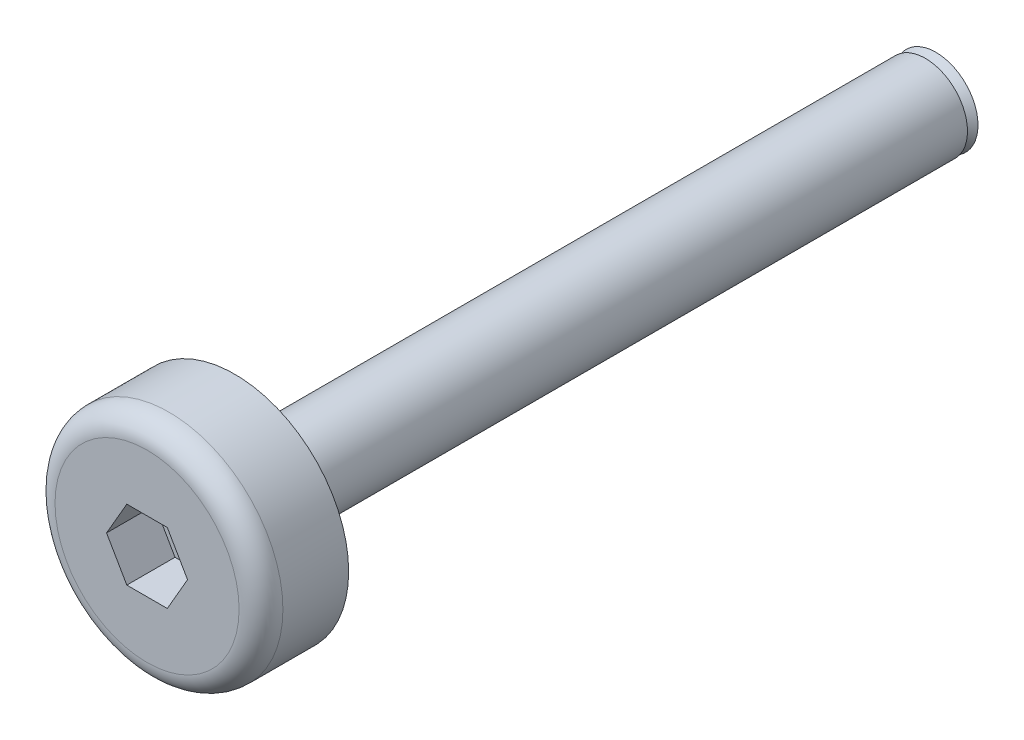
ISO-10303-21;
HEADER;
FILE_DESCRIPTION(('STEP AP214'),'2;1');
FILE_NAME('part.step','',(''),(''),'','','');
FILE_SCHEMA(('AUTOMOTIVE_DESIGN { 1 0 10303 214 1 1 1 1 }'));
ENDSEC;
DATA;
#1=APPLICATION_CONTEXT('core data for automotive mechanical design processes');
#2=APPLICATION_PROTOCOL_DEFINITION('international standard','automotive_design',2000,#1);
#3=PRODUCT_CONTEXT('',#1,'mechanical');
#4=PRODUCT('Part','Part','',(#3));
#5=PRODUCT_RELATED_PRODUCT_CATEGORY('part','',(#4));
#6=PRODUCT_DEFINITION_FORMATION('','',#4);
#7=PRODUCT_DEFINITION_CONTEXT('part definition',#1,'design');
#8=PRODUCT_DEFINITION('design','',#6,#7);
#9=PRODUCT_DEFINITION_SHAPE('','',#8);
#10=(LENGTH_UNIT() NAMED_UNIT(*) SI_UNIT(.MILLI.,.METRE.));
#11=(NAMED_UNIT(*) PLANE_ANGLE_UNIT() SI_UNIT($,.RADIAN.));
#12=(NAMED_UNIT(*) SI_UNIT($,.STERADIAN.) SOLID_ANGLE_UNIT());
#13=UNCERTAINTY_MEASURE_WITH_UNIT(LENGTH_MEASURE(1.E-05),#10,'distance_accuracy_value','');
#14=(GEOMETRIC_REPRESENTATION_CONTEXT(3) GLOBAL_UNCERTAINTY_ASSIGNED_CONTEXT((#13)) GLOBAL_UNIT_ASSIGNED_CONTEXT((#10,
#11,#12)) REPRESENTATION_CONTEXT('',''));
#15=CARTESIAN_POINT('',(0.,0.,0.));
#16=DIRECTION('',(0.,0.,1.));
#17=DIRECTION('',(1.,0.,0.));
#18=AXIS2_PLACEMENT_3D('',#15,#16,#17);
#19=CARTESIAN_POINT('',(0.,0.,-20.));
#20=DIRECTION('',(0.,0.,1.));
#21=DIRECTION('',(1.,0.,0.));
#22=AXIS2_PLACEMENT_3D('',#19,#20,#21);
#23=PLANE('',#22);
#24=CARTESIAN_POINT('',(0.,0.,-20.));
#25=DIRECTION('',(0.,0.,1.));
#26=DIRECTION('',(1.,0.,0.));
#27=AXIS2_PLACEMENT_3D('',#24,#25,#26);
#28=CIRCLE('',#27,1.2);
#29=CARTESIAN_POINT('',(1.2,0.,-20.));
#30=VERTEX_POINT('',#29);
#31=EDGE_CURVE('E9',#30,#30,#28,.T.);
#32=ORIENTED_EDGE('',*,*,#31,.F.);
#33=EDGE_LOOP('',(#32));
#34=FACE_BOUND('',#33,.T.);
#35=ADVANCED_FACE('F14',(#34),#23,.F.);
#36=CARTESIAN_POINT('',(0.,0.,-20.));
#37=DIRECTION('',(0.,0.,-1.));
#38=DIRECTION('',(1.,0.,0.));
#39=AXIS2_PLACEMENT_3D('',#36,#37,#38);
#40=CONICAL_SURFACE('',#39,1.2,0.785398163397);
#41=CARTESIAN_POINT('',(0.,0.,-19.7));
#42=DIRECTION('',(0.,0.,1.));
#43=DIRECTION('',(1.,0.,0.));
#44=AXIS2_PLACEMENT_3D('',#41,#42,#43);
#45=CIRCLE('',#44,0.9);
#46=CARTESIAN_POINT('',(0.9,0.,-19.7));
#47=VERTEX_POINT('',#46);
#48=EDGE_CURVE('E166',#47,#47,#45,.T.);
#49=ORIENTED_EDGE('',*,*,#48,.F.);
#50=DIRECTION('',(-0.707106781186548,0.,0.707106781186548));
#51=VECTOR('',#50,1.);
#52=CARTESIAN_POINT('',(1.2,0.,-20.));
#53=LINE('',#52,#51);
#54=EDGE_CURVE('E25',#30,#47,#53,.T.);
#55=ORIENTED_EDGE('',*,*,#54,.F.);
#56=ORIENTED_EDGE('',*,*,#31,.T.);
#57=ORIENTED_EDGE('',*,*,#54,.T.);
#58=EDGE_LOOP('',(#49,#55,#56,#57));
#59=FACE_BOUND('',#58,.T.);
#60=ADVANCED_FACE('F325',(#59),#40,.T.);
#61=CARTESIAN_POINT('',(0.,0.,1.125));
#62=DIRECTION('',(0.,0.,1.));
#63=DIRECTION('',(1.,0.,0.));
#64=AXIS2_PLACEMENT_3D('',#61,#62,#63);
#65=PLANE('',#64);
#66=DIRECTION('',(-0.50000000000019,0.866025403784329,0.));
#67=VECTOR('',#66,1.);
#68=CARTESIAN_POINT('',(1.154700538379,0.,1.125));
#69=LINE('',#68,#67);
#70=CARTESIAN_POINT('',(1.154700538379,0.,1.125));
#71=VERTEX_POINT('',#70);
#72=CARTESIAN_POINT('',(0.57735026919,1.,1.125));
#73=VERTEX_POINT('',#72);
#74=EDGE_CURVE('E197',#71,#73,#69,.T.);
#75=ORIENTED_EDGE('',*,*,#74,.T.);
#76=DIRECTION('',(-1.,0.,0.));
#77=VECTOR('',#76,1.);
#78=CARTESIAN_POINT('',(0.57735026919,1.,1.125));
#79=LINE('',#78,#77);
#80=CARTESIAN_POINT('',(-0.57735026919,1.,1.125));
#81=VERTEX_POINT('',#80);
#82=EDGE_CURVE('E136',#73,#81,#79,.T.);
#83=ORIENTED_EDGE('',*,*,#82,.T.);
#84=DIRECTION('',(-0.50000000000019,-0.866025403784329,0.));
#85=VECTOR('',#84,1.);
#86=CARTESIAN_POINT('',(-0.57735026919,1.,1.125));
#87=LINE('',#86,#85);
#88=CARTESIAN_POINT('',(-1.154700538379,0.,1.125));
#89=VERTEX_POINT('',#88);
#90=EDGE_CURVE('E141',#81,#89,#87,.T.);
#91=ORIENTED_EDGE('',*,*,#90,.T.);
#92=DIRECTION('',(0.50000000000019,-0.866025403784329,0.));
#93=VECTOR('',#92,1.);
#94=CARTESIAN_POINT('',(-1.154700538379,0.,1.125));
#95=LINE('',#94,#93);
#96=CARTESIAN_POINT('',(-0.57735026919,-1.,1.125));
#97=VERTEX_POINT('',#96);
#98=EDGE_CURVE('E131',#89,#97,#95,.T.);
#99=ORIENTED_EDGE('',*,*,#98,.T.);
#100=DIRECTION('',(1.,0.,0.));
#101=VECTOR('',#100,1.);
#102=CARTESIAN_POINT('',(-0.57735026919,-1.,1.125));
#103=LINE('',#102,#101);
#104=CARTESIAN_POINT('',(0.57735026919,-1.,1.125));
#105=VERTEX_POINT('',#104);
#106=EDGE_CURVE('E130',#97,#105,#103,.T.);
#107=ORIENTED_EDGE('',*,*,#106,.T.);
#108=DIRECTION('',(0.50000000000019,0.866025403784329,0.));
#109=VECTOR('',#108,1.);
#110=CARTESIAN_POINT('',(0.57735026919,-1.,1.125));
#111=LINE('',#110,#109);
#112=EDGE_CURVE('E18',#105,#71,#111,.T.);
#113=ORIENTED_EDGE('',*,*,#112,.T.);
#114=EDGE_LOOP('',(#75,#83,#91,#99,#107,#113));
#115=FACE_BOUND('',#114,.T.);
#116=ADVANCED_FACE('F213',(#115),#65,.T.);
#117=CARTESIAN_POINT('',(0.,0.,-19.7));
#118=DIRECTION('',(0.,0.,1.));
#119=DIRECTION('',(1.,0.,0.));
#120=AXIS2_PLACEMENT_3D('',#117,#118,#119);
#121=PLANE('',#120);
#122=ORIENTED_EDGE('',*,*,#48,.T.);
#123=EDGE_LOOP('',(#122));
#124=FACE_BOUND('',#123,.T.);
#125=CARTESIAN_POINT('',(0.,0.,-19.7));
#126=DIRECTION('',(0.,0.,1.));
#127=DIRECTION('',(1.,0.,0.));
#128=AXIS2_PLACEMENT_3D('',#125,#126,#127);
#129=CIRCLE('',#128,1.2);
#130=CARTESIAN_POINT('',(1.2,0.,-19.7));
#131=VERTEX_POINT('',#130);
#132=EDGE_CURVE('E149',#131,#131,#129,.T.);
#133=ORIENTED_EDGE('',*,*,#132,.F.);
#134=EDGE_LOOP('',(#133));
#135=FACE_BOUND('',#134,.T.);
#136=ADVANCED_FACE('F324',(#124,#135),#121,.F.);
#137=CARTESIAN_POINT('',(1.154700538379,0.,1.125));
#138=DIRECTION('',(-0.866025403784329,-0.50000000000019,0.));
#139=DIRECTION('',(-0.50000000000019,0.866025403784329,0.));
#140=AXIS2_PLACEMENT_3D('',#137,#138,#139);
#141=PLANE('',#140);
#142=ORIENTED_EDGE('',*,*,#74,.F.);
#143=DIRECTION('',(0.,0.,1.));
#144=VECTOR('',#143,1.);
#145=CARTESIAN_POINT('',(1.154700538379,0.,1.125));
#146=LINE('',#145,#144);
#147=CARTESIAN_POINT('',(1.154700538379,0.,2.5));
#148=VERTEX_POINT('',#147);
#149=EDGE_CURVE('E202',#71,#148,#146,.T.);
#150=ORIENTED_EDGE('',*,*,#149,.T.);
#151=DIRECTION('',(0.50000000000019,-0.866025403784329,0.));
#152=VECTOR('',#151,1.);
#153=CARTESIAN_POINT('',(1.010362971082,0.25,2.5));
#154=LINE('',#153,#152);
#155=CARTESIAN_POINT('',(0.57735026919,1.,2.5));
#156=VERTEX_POINT('',#155);
#157=EDGE_CURVE('E184',#156,#148,#154,.T.);
#158=ORIENTED_EDGE('',*,*,#157,.F.);
#159=DIRECTION('',(0.,0.,1.));
#160=VECTOR('',#159,1.);
#161=CARTESIAN_POINT('',(0.57735026919,1.,1.125));
#162=LINE('',#161,#160);
#163=EDGE_CURVE('E132',#73,#156,#162,.T.);
#164=ORIENTED_EDGE('',*,*,#163,.F.);
#165=EDGE_LOOP('',(#142,#150,#158,#164));
#166=FACE_BOUND('',#165,.T.);
#167=ADVANCED_FACE('F387',(#166),#141,.T.);
#168=CARTESIAN_POINT('',(0.57735026919,-1.,1.125));
#169=DIRECTION('',(-0.866025403784329,0.50000000000019,0.));
#170=DIRECTION('',(0.,0.,1.));
#171=AXIS2_PLACEMENT_3D('',#168,#169,#170);
#172=PLANE('',#171);
#173=ORIENTED_EDGE('',*,*,#112,.F.);
#174=DIRECTION('',(0.,0.,1.));
#175=VECTOR('',#174,1.);
#176=CARTESIAN_POINT('',(0.57735026919,-1.,1.125));
#177=LINE('',#176,#175);
#178=CARTESIAN_POINT('',(0.57735026919,-1.,2.5));
#179=VERTEX_POINT('',#178);
#180=EDGE_CURVE('E126',#105,#179,#177,.T.);
#181=ORIENTED_EDGE('',*,*,#180,.T.);
#182=DIRECTION('',(-0.50000000000019,-0.866025403784329,0.));
#183=VECTOR('',#182,1.);
#184=CARTESIAN_POINT('',(0.721687836487,-0.75,2.5));
#185=LINE('',#184,#183);
#186=EDGE_CURVE('E160',#148,#179,#185,.T.);
#187=ORIENTED_EDGE('',*,*,#186,.F.);
#188=ORIENTED_EDGE('',*,*,#149,.F.);
#189=EDGE_LOOP('',(#173,#181,#187,#188));
#190=FACE_BOUND('',#189,.T.);
#191=ADVANCED_FACE('F240',(#190),#172,.T.);
#192=CARTESIAN_POINT('',(-0.57735026919,-1.,1.125));
#193=DIRECTION('',(0.,1.,0.));
#194=DIRECTION('',(1.,0.,0.));
#195=AXIS2_PLACEMENT_3D('',#192,#193,#194);
#196=PLANE('',#195);
#197=ORIENTED_EDGE('',*,*,#106,.F.);
#198=DIRECTION('',(0.,0.,1.));
#199=VECTOR('',#198,1.);
#200=CARTESIAN_POINT('',(-0.57735026919,-1.,1.125));
#201=LINE('',#200,#199);
#202=CARTESIAN_POINT('',(-0.57735026919,-1.,2.5));
#203=VERTEX_POINT('',#202);
#204=EDGE_CURVE('E127',#97,#203,#201,.T.);
#205=ORIENTED_EDGE('',*,*,#204,.T.);
#206=DIRECTION('',(-1.,0.,0.));
#207=VECTOR('',#206,1.);
#208=CARTESIAN_POINT('',(-0.288675134595,-1.,2.5));
#209=LINE('',#208,#207);
#210=EDGE_CURVE('E155',#179,#203,#209,.T.);
#211=ORIENTED_EDGE('',*,*,#210,.F.);
#212=ORIENTED_EDGE('',*,*,#180,.F.);
#213=EDGE_LOOP('',(#197,#205,#211,#212));
#214=FACE_BOUND('',#213,.T.);
#215=ADVANCED_FACE('F229',(#214),#196,.T.);
#216=CARTESIAN_POINT('',(-1.154700538379,0.,1.125));
#217=DIRECTION('',(0.866025403784329,0.50000000000019,0.));
#218=DIRECTION('',(0.,0.,-1.));
#219=AXIS2_PLACEMENT_3D('',#216,#217,#218);
#220=PLANE('',#219);
#221=ORIENTED_EDGE('',*,*,#98,.F.);
#222=DIRECTION('',(0.,0.,1.));
#223=VECTOR('',#222,1.);
#224=CARTESIAN_POINT('',(-1.154700538379,0.,1.125));
#225=LINE('',#224,#223);
#226=CARTESIAN_POINT('',(-1.154700538379,0.,2.5));
#227=VERTEX_POINT('',#226);
#228=EDGE_CURVE('E145',#89,#227,#225,.T.);
#229=ORIENTED_EDGE('',*,*,#228,.T.);
#230=DIRECTION('',(-0.50000000000019,0.866025403784329,0.));
#231=VECTOR('',#230,1.);
#232=CARTESIAN_POINT('',(-1.010362971082,-0.25,2.5));
#233=LINE('',#232,#231);
#234=EDGE_CURVE('E159',#203,#227,#233,.T.);
#235=ORIENTED_EDGE('',*,*,#234,.F.);
#236=ORIENTED_EDGE('',*,*,#204,.F.);
#237=EDGE_LOOP('',(#221,#229,#235,#236));
#238=FACE_BOUND('',#237,.T.);
#239=ADVANCED_FACE('F227',(#238),#220,.T.);
#240=CARTESIAN_POINT('',(-0.57735026919,1.,1.125));
#241=DIRECTION('',(0.866025403784329,-0.50000000000019,0.));
#242=DIRECTION('',(0.,0.,-1.));
#243=AXIS2_PLACEMENT_3D('',#240,#241,#242);
#244=PLANE('',#243);
#245=ORIENTED_EDGE('',*,*,#90,.F.);
#246=DIRECTION('',(0.,0.,1.));
#247=VECTOR('',#246,1.);
#248=CARTESIAN_POINT('',(-0.57735026919,1.,1.125));
#249=LINE('',#248,#247);
#250=CARTESIAN_POINT('',(-0.57735026919,1.,2.5));
#251=VERTEX_POINT('',#250);
#252=EDGE_CURVE('E135',#81,#251,#249,.T.);
#253=ORIENTED_EDGE('',*,*,#252,.T.);
#254=DIRECTION('',(0.50000000000019,0.866025403784329,0.));
#255=VECTOR('',#254,1.);
#256=CARTESIAN_POINT('',(-0.721687836487,0.75,2.5));
#257=LINE('',#256,#255);
#258=EDGE_CURVE('E150',#227,#251,#257,.T.);
#259=ORIENTED_EDGE('',*,*,#258,.F.);
#260=ORIENTED_EDGE('',*,*,#228,.F.);
#261=EDGE_LOOP('',(#245,#253,#259,#260));
#262=FACE_BOUND('',#261,.T.);
#263=ADVANCED_FACE('F222',(#262),#244,.T.);
#264=CARTESIAN_POINT('',(0.57735026919,1.,1.125));
#265=DIRECTION('',(0.,-1.,0.));
#266=DIRECTION('',(-1.,0.,0.));
#267=AXIS2_PLACEMENT_3D('',#264,#265,#266);
#268=PLANE('',#267);
#269=ORIENTED_EDGE('',*,*,#82,.F.);
#270=ORIENTED_EDGE('',*,*,#163,.T.);
#271=DIRECTION('',(1.,0.,0.));
#272=VECTOR('',#271,1.);
#273=CARTESIAN_POINT('',(0.288675134595,1.,2.5));
#274=LINE('',#273,#272);
#275=EDGE_CURVE('E120',#251,#156,#274,.T.);
#276=ORIENTED_EDGE('',*,*,#275,.F.);
#277=ORIENTED_EDGE('',*,*,#252,.F.);
#278=EDGE_LOOP('',(#269,#270,#276,#277));
#279=FACE_BOUND('',#278,.T.);
#280=ADVANCED_FACE('F218',(#279),#268,.T.);
#281=CARTESIAN_POINT('',(0.,0.,-19.7));
#282=DIRECTION('',(0.,0.,1.));
#283=DIRECTION('',(1.,0.,0.));
#284=AXIS2_PLACEMENT_3D('',#281,#282,#283);
#285=CYLINDRICAL_SURFACE('',#284,1.2);
#286=CARTESIAN_POINT('',(0.,0.,0.));
#287=DIRECTION('',(0.,0.,1.));
#288=DIRECTION('',(1.,0.,0.));
#289=AXIS2_PLACEMENT_3D('',#286,#287,#288);
#290=CIRCLE('',#289,1.2);
#291=CARTESIAN_POINT('',(1.2,0.,0.));
#292=VERTEX_POINT('',#291);
#293=EDGE_CURVE('E111',#292,#292,#290,.T.);
#294=ORIENTED_EDGE('',*,*,#293,.F.);
#295=DIRECTION('',(0.,0.,1.));
#296=VECTOR('',#295,1.);
#297=CARTESIAN_POINT('',(1.2,0.,-19.7));
#298=LINE('',#297,#296);
#299=EDGE_CURVE('E146',#131,#292,#298,.T.);
#300=ORIENTED_EDGE('',*,*,#299,.F.);
#301=ORIENTED_EDGE('',*,*,#132,.T.);
#302=ORIENTED_EDGE('',*,*,#299,.T.);
#303=EDGE_LOOP('',(#294,#300,#301,#302));
#304=FACE_BOUND('',#303,.T.);
#305=ADVANCED_FACE('F16',(#304),#285,.T.);
#306=CARTESIAN_POINT('',(0.,0.,2.5));
#307=DIRECTION('',(0.,0.,1.));
#308=DIRECTION('',(1.,0.,0.));
#309=AXIS2_PLACEMENT_3D('',#306,#307,#308);
#310=PLANE('',#309);
#311=ORIENTED_EDGE('',*,*,#275,.T.);
#312=ORIENTED_EDGE('',*,*,#157,.T.);
#313=ORIENTED_EDGE('',*,*,#186,.T.);
#314=ORIENTED_EDGE('',*,*,#210,.T.);
#315=ORIENTED_EDGE('',*,*,#234,.T.);
#316=ORIENTED_EDGE('',*,*,#258,.T.);
#317=EDGE_LOOP('',(#311,#312,#313,#314,#315,#316));
#318=FACE_BOUND('',#317,.T.);
#319=CARTESIAN_POINT('',(0.,0.,2.5));
#320=DIRECTION('',(0.,0.,1.));
#321=DIRECTION('',(1.,0.,0.));
#322=AXIS2_PLACEMENT_3D('',#319,#320,#321);
#323=CIRCLE('',#322,2.625);
#324=CARTESIAN_POINT('',(2.625,0.,2.5));
#325=VERTEX_POINT('',#324);
#326=EDGE_CURVE('E106',#325,#325,#323,.T.);
#327=ORIENTED_EDGE('',*,*,#326,.T.);
#328=EDGE_LOOP('',(#327));
#329=FACE_BOUND('',#328,.T.);
#330=ADVANCED_FACE('F107',(#318,#329),#310,.T.);
#331=CARTESIAN_POINT('',(0.,0.,0.));
#332=DIRECTION('',(0.,0.,1.));
#333=DIRECTION('',(1.,0.,0.));
#334=AXIS2_PLACEMENT_3D('',#331,#332,#333);
#335=PLANE('',#334);
#336=ORIENTED_EDGE('',*,*,#293,.T.);
#337=EDGE_LOOP('',(#336));
#338=FACE_BOUND('',#337,.T.);
#339=CARTESIAN_POINT('',(0.,0.,0.));
#340=DIRECTION('',(0.,0.,1.));
#341=DIRECTION('',(1.,0.,0.));
#342=AXIS2_PLACEMENT_3D('',#339,#340,#341);
#343=CIRCLE('',#342,3.25);
#344=CARTESIAN_POINT('',(3.25,0.,0.));
#345=VERTEX_POINT('',#344);
#346=EDGE_CURVE('E122',#345,#345,#343,.T.);
#347=ORIENTED_EDGE('',*,*,#346,.F.);
#348=EDGE_LOOP('',(#347));
#349=FACE_BOUND('',#348,.T.);
#350=ADVANCED_FACE('F351',(#338,#349),#335,.F.);
#351=CARTESIAN_POINT('',(0.,0.,1.875));
#352=DIRECTION('',(0.,0.,1.));
#353=DIRECTION('',(1.,0.,0.));
#354=AXIS2_PLACEMENT_3D('',#351,#352,#353);
#355=TOROIDAL_SURFACE('',#354,2.625,0.625);
#356=CARTESIAN_POINT('',(2.625,0.,1.875));
#357=DIRECTION('',(0.,-1.,0.));
#358=DIRECTION('',(1.,0.,0.));
#359=AXIS2_PLACEMENT_3D('',#356,#357,#358);
#360=CIRCLE('',#359,0.625);
#361=CARTESIAN_POINT('',(3.25,0.,1.875));
#362=VERTEX_POINT('',#361);
#363=EDGE_CURVE('E112',#362,#325,#360,.T.);
#364=ORIENTED_EDGE('',*,*,#363,.F.);
#365=CARTESIAN_POINT('',(0.,0.,1.875));
#366=DIRECTION('',(0.,0.,1.));
#367=DIRECTION('',(1.,0.,0.));
#368=AXIS2_PLACEMENT_3D('',#365,#366,#367);
#369=CIRCLE('',#368,3.25);
#370=EDGE_CURVE('E140',#362,#362,#369,.T.);
#371=ORIENTED_EDGE('',*,*,#370,.T.);
#372=ORIENTED_EDGE('',*,*,#363,.T.);
#373=ORIENTED_EDGE('',*,*,#326,.F.);
#374=EDGE_LOOP('',(#364,#371,#372,#373));
#375=FACE_BOUND('',#374,.T.);
#376=ADVANCED_FACE('F356',(#375),#355,.T.);
#377=CARTESIAN_POINT('',(0.,0.,0.));
#378=DIRECTION('',(0.,0.,1.));
#379=DIRECTION('',(1.,0.,0.));
#380=AXIS2_PLACEMENT_3D('',#377,#378,#379);
#381=CYLINDRICAL_SURFACE('',#380,3.25);
#382=DIRECTION('',(0.,0.,1.));
#383=VECTOR('',#382,1.);
#384=CARTESIAN_POINT('',(3.25,0.,0.));
#385=LINE('',#384,#383);
#386=EDGE_CURVE('E154',#345,#362,#385,.T.);
#387=ORIENTED_EDGE('',*,*,#386,.T.);
#388=ORIENTED_EDGE('',*,*,#370,.F.);
#389=ORIENTED_EDGE('',*,*,#386,.F.);
#390=ORIENTED_EDGE('',*,*,#346,.T.);
#391=EDGE_LOOP('',(#387,#388,#389,#390));
#392=FACE_BOUND('',#391,.T.);
#393=ADVANCED_FACE('F376',(#392),#381,.T.);
#394=CLOSED_SHELL('',(#35,#60,#116,#136,#167,#191,#215,#239,#263,#280,#305,#330,#350,#376,#393));
#395=MANIFOLD_SOLID_BREP('B1',#394);
#396=ADVANCED_BREP_SHAPE_REPRESENTATION('',(#18,#395),#14);
#397=SHAPE_DEFINITION_REPRESENTATION(#9,#396);
ENDSEC;
END-ISO-10303-21;
